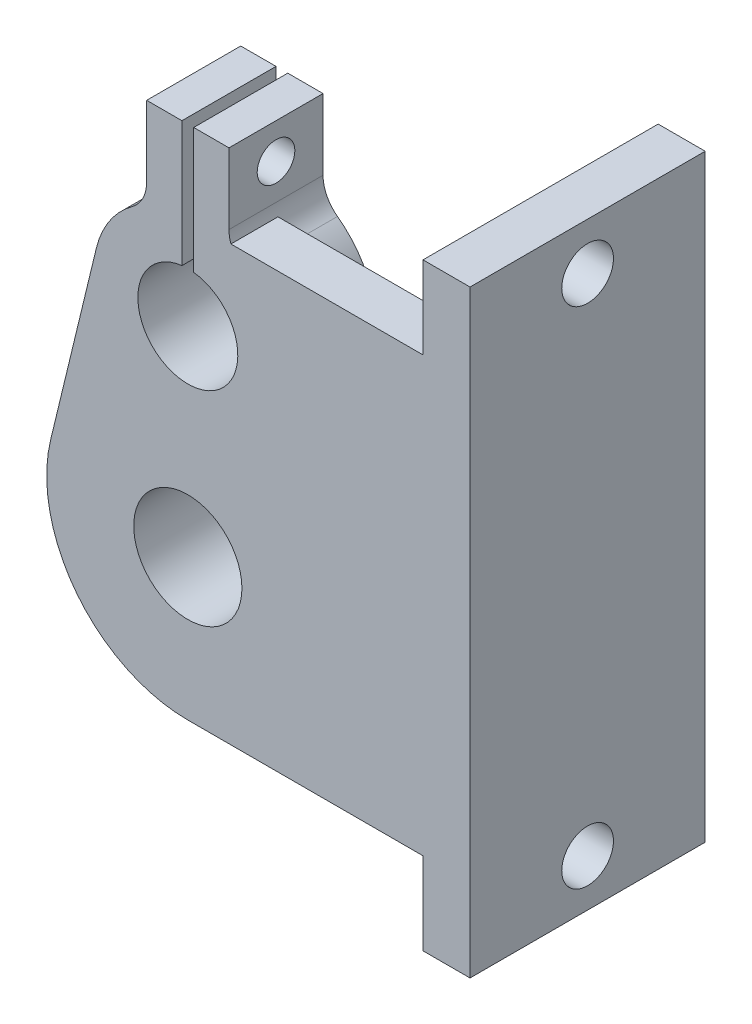
ISO-10303-21;
HEADER;
FILE_DESCRIPTION(('STEP AP214'),'2;1');
FILE_NAME('part.step','',(''),(''),'','','');
FILE_SCHEMA(('AUTOMOTIVE_DESIGN { 1 0 10303 214 1 1 1 1 }'));
ENDSEC;
DATA;
#1=APPLICATION_CONTEXT('core data for automotive mechanical design processes');
#2=APPLICATION_PROTOCOL_DEFINITION('international standard','automotive_design',2000,#1);
#3=PRODUCT_CONTEXT('',#1,'mechanical');
#4=PRODUCT('Part','Part','',(#3));
#5=PRODUCT_RELATED_PRODUCT_CATEGORY('part','',(#4));
#6=PRODUCT_DEFINITION_FORMATION('','',#4);
#7=PRODUCT_DEFINITION_CONTEXT('part definition',#1,'design');
#8=PRODUCT_DEFINITION('design','',#6,#7);
#9=PRODUCT_DEFINITION_SHAPE('','',#8);
#10=(LENGTH_UNIT() NAMED_UNIT(*) SI_UNIT(.MILLI.,.METRE.));
#11=(NAMED_UNIT(*) PLANE_ANGLE_UNIT() SI_UNIT($,.RADIAN.));
#12=(NAMED_UNIT(*) SI_UNIT($,.STERADIAN.) SOLID_ANGLE_UNIT());
#13=UNCERTAINTY_MEASURE_WITH_UNIT(LENGTH_MEASURE(1.E-05),#10,'distance_accuracy_value','');
#14=(GEOMETRIC_REPRESENTATION_CONTEXT(3) GLOBAL_UNCERTAINTY_ASSIGNED_CONTEXT((#13)) GLOBAL_UNIT_ASSIGNED_CONTEXT((#10,
#11,#12)) REPRESENTATION_CONTEXT('',''));
#15=CARTESIAN_POINT('',(0.,0.,0.));
#16=DIRECTION('',(0.,0.,1.));
#17=DIRECTION('',(1.,0.,0.));
#18=AXIS2_PLACEMENT_3D('',#15,#16,#17);
#19=CARTESIAN_POINT('',(48.,0.,4.));
#20=DIRECTION('',(1.,0.,0.));
#21=DIRECTION('',(0.,0.,-1.));
#22=AXIS2_PLACEMENT_3D('',#19,#20,#21);
#23=PLANE('',#22);
#24=DIRECTION('',(0.,-1.,0.));
#25=VECTOR('',#24,1.);
#26=CARTESIAN_POINT('',(48.,0.,4.));
#27=LINE('',#26,#25);
#28=CARTESIAN_POINT('',(48.,52.893747284969,4.));
#29=VERTEX_POINT('',#28);
#30=CARTESIAN_POINT('',(48.,2.,4.));
#31=VERTEX_POINT('',#30);
#32=EDGE_CURVE('E381',#29,#31,#27,.T.);
#33=ORIENTED_EDGE('',*,*,#32,.T.);
#34=DIRECTION('',(0.,0.,-1.));
#35=VECTOR('',#34,1.);
#36=CARTESIAN_POINT('',(48.,2.,4.));
#37=LINE('',#36,#35);
#38=CARTESIAN_POINT('',(48.,2.,-16.));
#39=VERTEX_POINT('',#38);
#40=EDGE_CURVE('E447',#31,#39,#37,.T.);
#41=ORIENTED_EDGE('',*,*,#40,.T.);
#42=DIRECTION('',(0.,-1.,0.));
#43=VECTOR('',#42,1.);
#44=CARTESIAN_POINT('',(48.,0.,-16.));
#45=LINE('',#44,#43);
#46=CARTESIAN_POINT('',(48.,52.893747284969,-16.));
#47=VERTEX_POINT('',#46);
#48=EDGE_CURVE('E304',#47,#39,#45,.T.);
#49=ORIENTED_EDGE('',*,*,#48,.F.);
#50=DIRECTION('',(0.,0.,-1.));
#51=VECTOR('',#50,1.);
#52=CARTESIAN_POINT('',(48.,52.893747284969,4.));
#53=LINE('',#52,#51);
#54=EDGE_CURVE('E445',#29,#47,#53,.T.);
#55=ORIENTED_EDGE('',*,*,#54,.F.);
#56=EDGE_LOOP('',(#33,#41,#49,#55));
#57=FACE_BOUND('',#56,.T.);
#58=CARTESIAN_POINT('',(48.,48.893747284969,-5.99999999999999));
#59=DIRECTION('',(-1.,0.,0.));
#60=DIRECTION('',(0.,0.,1.));
#61=AXIS2_PLACEMENT_3D('',#58,#59,#60);
#62=CIRCLE('',#61,2.20000000000006);
#63=CARTESIAN_POINT('',(48.,48.893747284969,-3.79999999999993));
#64=VERTEX_POINT('',#63);
#65=EDGE_CURVE('E284',#64,#64,#62,.T.);
#66=ORIENTED_EDGE('',*,*,#65,.T.);
#67=EDGE_LOOP('',(#66));
#68=FACE_BOUND('',#67,.T.);
#69=CARTESIAN_POINT('',(48.,6.,-6.));
#70=DIRECTION('',(-1.,0.,0.));
#71=DIRECTION('',(0.,0.,1.));
#72=AXIS2_PLACEMENT_3D('',#69,#70,#71);
#73=CIRCLE('',#72,2.19999999999994);
#74=CARTESIAN_POINT('',(48.,6.,-3.80000000000006));
#75=VERTEX_POINT('',#74);
#76=EDGE_CURVE('E290',#75,#75,#73,.F.);
#77=ORIENTED_EDGE('',*,*,#76,.F.);
#78=EDGE_LOOP('',(#77));
#79=FACE_BOUND('',#78,.T.);
#80=ADVANCED_FACE('F38',(#57,#68,#79),#23,.T.);
#81=CARTESIAN_POINT('',(44.0000000000017,0.,4.));
#82=DIRECTION('',(-1.,0.,0.));
#83=DIRECTION('',(0.,0.,1.));
#84=AXIS2_PLACEMENT_3D('',#81,#82,#83);
#85=PLANE('',#84);
#86=DIRECTION('',(0.,0.,-1.));
#87=VECTOR('',#86,1.);
#88=CARTESIAN_POINT('',(44.0000000000017,38.393747284969,4.));
#89=LINE('',#88,#87);
#90=CARTESIAN_POINT('',(44.0000000000017,38.393747284969,0.));
#91=VERTEX_POINT('',#90);
#92=CARTESIAN_POINT('',(44.0000000000017,38.393747284969,-13.9999999999997));
#93=VERTEX_POINT('',#92);
#94=EDGE_CURVE('E235',#91,#93,#89,.T.);
#95=ORIENTED_EDGE('',*,*,#94,.F.);
#96=DIRECTION('',(0.,1.,0.));
#97=VECTOR('',#96,1.);
#98=CARTESIAN_POINT('',(44.0000000000017,0.,0.));
#99=LINE('',#98,#97);
#100=CARTESIAN_POINT('',(44.0000000000017,45.893747284969,0.));
#101=VERTEX_POINT('',#100);
#102=EDGE_CURVE('E42',#91,#101,#99,.T.);
#103=ORIENTED_EDGE('',*,*,#102,.T.);
#104=DIRECTION('',(0.,0.,-1.));
#105=VECTOR('',#104,1.);
#106=CARTESIAN_POINT('',(44.0000000000017,45.893747284969,4.));
#107=LINE('',#106,#105);
#108=CARTESIAN_POINT('',(44.0000000000017,45.893747284969,4.));
#109=VERTEX_POINT('',#108);
#110=EDGE_CURVE('E442',#109,#101,#107,.T.);
#111=ORIENTED_EDGE('',*,*,#110,.F.);
#112=DIRECTION('',(0.,1.,0.));
#113=VECTOR('',#112,1.);
#114=CARTESIAN_POINT('',(44.0000000000017,0.,4.));
#115=LINE('',#114,#113);
#116=CARTESIAN_POINT('',(44.0000000000017,52.893747284969,4.));
#117=VERTEX_POINT('',#116);
#118=EDGE_CURVE('E378',#109,#117,#115,.T.);
#119=ORIENTED_EDGE('',*,*,#118,.T.);
#120=DIRECTION('',(0.,0.,-1.));
#121=VECTOR('',#120,1.);
#122=CARTESIAN_POINT('',(44.0000000000017,52.893747284969,4.));
#123=LINE('',#122,#121);
#124=CARTESIAN_POINT('',(44.0000000000017,52.893747284969,-16.));
#125=VERTEX_POINT('',#124);
#126=EDGE_CURVE('E443',#117,#125,#123,.T.);
#127=ORIENTED_EDGE('',*,*,#126,.T.);
#128=DIRECTION('',(0.,1.,0.));
#129=VECTOR('',#128,1.);
#130=CARTESIAN_POINT('',(44.0000000000017,0.,-16.));
#131=LINE('',#130,#129);
#132=CARTESIAN_POINT('',(44.0000000000017,2.,-16.));
#133=VERTEX_POINT('',#132);
#134=EDGE_CURVE('E298',#133,#125,#131,.T.);
#135=ORIENTED_EDGE('',*,*,#134,.F.);
#136=DIRECTION('',(0.,0.,-1.));
#137=VECTOR('',#136,1.);
#138=CARTESIAN_POINT('',(44.,2.,4.));
#139=LINE('',#138,#137);
#140=CARTESIAN_POINT('',(44.,2.,4.));
#141=VERTEX_POINT('',#140);
#142=EDGE_CURVE('E450',#141,#133,#139,.T.);
#143=ORIENTED_EDGE('',*,*,#142,.F.);
#144=CARTESIAN_POINT('',(44.0000000000009,9.00000000000001,4.));
#145=VERTEX_POINT('',#144);
#146=EDGE_CURVE('E374',#141,#145,#115,.T.);
#147=ORIENTED_EDGE('',*,*,#146,.T.);
#148=DIRECTION('',(0.,0.,-1.));
#149=VECTOR('',#148,1.);
#150=CARTESIAN_POINT('',(44.0000000000009,9.00000000000001,4.));
#151=LINE('',#150,#149);
#152=CARTESIAN_POINT('',(44.0000000000009,9.00000000000001,0.));
#153=VERTEX_POINT('',#152);
#154=EDGE_CURVE('E452',#145,#153,#151,.T.);
#155=ORIENTED_EDGE('',*,*,#154,.T.);
#156=CARTESIAN_POINT('',(44.0000000000017,16.5,0.));
#157=VERTEX_POINT('',#156);
#158=EDGE_CURVE('E11',#153,#157,#99,.T.);
#159=ORIENTED_EDGE('',*,*,#158,.T.);
#160=DIRECTION('',(0.,0.,1.));
#161=VECTOR('',#160,1.);
#162=CARTESIAN_POINT('',(44.0000000000017,16.5,4.));
#163=LINE('',#162,#161);
#164=CARTESIAN_POINT('',(44.0000000000017,16.5,-13.9999999999997));
#165=VERTEX_POINT('',#164);
#166=EDGE_CURVE('E266',#165,#157,#163,.T.);
#167=ORIENTED_EDGE('',*,*,#166,.F.);
#168=DIRECTION('',(0.,1.,0.));
#169=VECTOR('',#168,1.);
#170=CARTESIAN_POINT('',(44.0000000000017,0.,-13.9999999999997));
#171=LINE('',#170,#169);
#172=CARTESIAN_POINT('',(44.0000000000017,21.5,-13.9999999999997));
#173=VERTEX_POINT('',#172);
#174=EDGE_CURVE('E270',#173,#165,#171,.F.);
#175=ORIENTED_EDGE('',*,*,#174,.F.);
#176=DIRECTION('',(0.,0.,1.));
#177=VECTOR('',#176,1.);
#178=CARTESIAN_POINT('',(44.0000000000017,21.5,4.));
#179=LINE('',#178,#177);
#180=CARTESIAN_POINT('',(44.0000000000017,21.5,0.));
#181=VERTEX_POINT('',#180);
#182=EDGE_CURVE('E260',#173,#181,#179,.T.);
#183=ORIENTED_EDGE('',*,*,#182,.T.);
#184=CARTESIAN_POINT('',(44.0000000000017,33.393747284969,0.));
#185=VERTEX_POINT('',#184);
#186=EDGE_CURVE('E48',#181,#185,#99,.T.);
#187=ORIENTED_EDGE('',*,*,#186,.T.);
#188=DIRECTION('',(0.,0.,-1.));
#189=VECTOR('',#188,1.);
#190=CARTESIAN_POINT('',(44.0000000000017,33.393747284969,4.));
#191=LINE('',#190,#189);
#192=CARTESIAN_POINT('',(44.0000000000017,33.393747284969,-13.9999999999997));
#193=VERTEX_POINT('',#192);
#194=EDGE_CURVE('E61',#185,#193,#191,.T.);
#195=ORIENTED_EDGE('',*,*,#194,.T.);
#196=DIRECTION('',(0.,-1.,0.));
#197=VECTOR('',#196,1.);
#198=CARTESIAN_POINT('',(44.0000000000017,0.,-13.9999999999997));
#199=LINE('',#198,#197);
#200=EDGE_CURVE('E56',#93,#193,#199,.T.);
#201=ORIENTED_EDGE('',*,*,#200,.F.);
#202=EDGE_LOOP('',(#95,#103,#111,#119,#127,#135,#143,#147,#155,#159,#167,#175,#183,#187,#195,#201));
#203=FACE_BOUND('',#202,.T.);
#204=CARTESIAN_POINT('',(44.0000000000017,48.893747284969,-5.99999999999999));
#205=DIRECTION('',(-1.,0.,0.));
#206=DIRECTION('',(0.,0.,1.));
#207=AXIS2_PLACEMENT_3D('',#204,#205,#206);
#208=CIRCLE('',#207,2.20000000000006);
#209=CARTESIAN_POINT('',(44.0000000000017,48.893747284969,-3.79999999999993));
#210=VERTEX_POINT('',#209);
#211=EDGE_CURVE('E283',#210,#210,#208,.T.);
#212=ORIENTED_EDGE('',*,*,#211,.F.);
#213=EDGE_LOOP('',(#212));
#214=FACE_BOUND('',#213,.T.);
#215=CARTESIAN_POINT('',(44.0000000000017,6.,-6.));
#216=DIRECTION('',(-1.,0.,0.));
#217=DIRECTION('',(0.,0.,1.));
#218=AXIS2_PLACEMENT_3D('',#215,#216,#217);
#219=CIRCLE('',#218,2.19999999999994);
#220=CARTESIAN_POINT('',(44.0000000000017,6.,-3.80000000000006));
#221=VERTEX_POINT('',#220);
#222=EDGE_CURVE('E287',#221,#221,#219,.F.);
#223=ORIENTED_EDGE('',*,*,#222,.T.);
#224=EDGE_LOOP('',(#223));
#225=FACE_BOUND('',#224,.T.);
#226=ADVANCED_FACE('F566',(#203,#214,#225),#85,.T.);
#227=CARTESIAN_POINT('',(0.,0.,0.));
#228=DIRECTION('',(0.,0.,1.));
#229=DIRECTION('',(1.,0.,0.));
#230=AXIS2_PLACEMENT_3D('',#227,#228,#229);
#231=PLANE('',#230);
#232=ORIENTED_EDGE('',*,*,#102,.F.);
#233=DIRECTION('',(-1.,0.,0.));
#234=VECTOR('',#233,1.);
#235=CARTESIAN_POINT('',(0.,38.393747284969,0.));
#236=LINE('',#235,#234);
#237=CARTESIAN_POINT('',(38.,38.393747284969,0.));
#238=VERTEX_POINT('',#237);
#239=EDGE_CURVE('E230',#91,#238,#236,.T.);
#240=ORIENTED_EDGE('',*,*,#239,.T.);
#241=DIRECTION('',(0.,-1.,0.));
#242=VECTOR('',#241,1.);
#243=CARTESIAN_POINT('',(38.,0.,0.));
#244=LINE('',#243,#242);
#245=CARTESIAN_POINT('',(38.,33.393747284969,0.));
#246=VERTEX_POINT('',#245);
#247=EDGE_CURVE('E224',#238,#246,#244,.T.);
#248=ORIENTED_EDGE('',*,*,#247,.T.);
#249=DIRECTION('',(-1.,0.,0.));
#250=VECTOR('',#249,1.);
#251=CARTESIAN_POINT('',(0.,33.393747284969,0.));
#252=LINE('',#251,#250);
#253=EDGE_CURVE('E228',#185,#246,#252,.T.);
#254=ORIENTED_EDGE('',*,*,#253,.F.);
#255=ORIENTED_EDGE('',*,*,#186,.F.);
#256=DIRECTION('',(1.,0.,0.));
#257=VECTOR('',#256,1.);
#258=CARTESIAN_POINT('',(0.,21.5,0.));
#259=LINE('',#258,#257);
#260=CARTESIAN_POINT('',(38.,21.5,0.));
#261=VERTEX_POINT('',#260);
#262=EDGE_CURVE('E255',#261,#181,#259,.T.);
#263=ORIENTED_EDGE('',*,*,#262,.F.);
#264=DIRECTION('',(0.,1.,0.));
#265=VECTOR('',#264,1.);
#266=CARTESIAN_POINT('',(38.,0.,0.));
#267=LINE('',#266,#265);
#268=CARTESIAN_POINT('',(38.,16.5,0.));
#269=VERTEX_POINT('',#268);
#270=EDGE_CURVE('E268',#261,#269,#267,.F.);
#271=ORIENTED_EDGE('',*,*,#270,.T.);
#272=DIRECTION('',(1.,0.,0.));
#273=VECTOR('',#272,1.);
#274=CARTESIAN_POINT('',(0.,16.5,0.));
#275=LINE('',#274,#273);
#276=EDGE_CURVE('E263',#269,#157,#275,.T.);
#277=ORIENTED_EDGE('',*,*,#276,.T.);
#278=ORIENTED_EDGE('',*,*,#158,.F.);
#279=DIRECTION('',(1.,0.,0.));
#280=VECTOR('',#279,1.);
#281=CARTESIAN_POINT('',(0.,9.00000000000001,0.));
#282=LINE('',#281,#280);
#283=CARTESIAN_POINT('',(24.,9.00000000000001,0.));
#284=VERTEX_POINT('',#283);
#285=EDGE_CURVE('E364',#284,#153,#282,.T.);
#286=ORIENTED_EDGE('',*,*,#285,.F.);
#287=CARTESIAN_POINT('',(24.,21.,0.));
#288=DIRECTION('',(0.,0.,1.));
#289=DIRECTION('',(1.,0.,0.));
#290=AXIS2_PLACEMENT_3D('',#287,#288,#289);
#291=CIRCLE('',#290,12.);
#292=CARTESIAN_POINT('',(35.6630905707235,23.8235294117647,0.));
#293=VERTEX_POINT('',#292);
#294=EDGE_CURVE('E353',#284,#293,#291,.T.);
#295=ORIENTED_EDGE('',*,*,#294,.T.);
#296=DIRECTION('',(0.235294117647059,-0.971924214226959,0.));
#297=VECTOR('',#296,1.);
#298=CARTESIAN_POINT('',(39.1368199060733,9.47467237930241,0.));
#299=LINE('',#298,#297);
#300=CARTESIAN_POINT('',(31.7753937138157,39.8823529411765,0.));
#301=VERTEX_POINT('',#300);
#302=EDGE_CURVE('E356',#301,#293,#299,.T.);
#303=ORIENTED_EDGE('',*,*,#302,.F.);
#304=CARTESIAN_POINT('',(24.,38.,0.));
#305=DIRECTION('',(0.,0.,1.));
#306=DIRECTION('',(1.,0.,0.));
#307=AXIS2_PLACEMENT_3D('',#304,#305,#306);
#308=CIRCLE('',#307,7.99999999999998);
#309=CARTESIAN_POINT('',(28.7272727272727,44.4539052179268,0.));
#310=VERTEX_POINT('',#309);
#311=EDGE_CURVE('E310',#301,#310,#308,.T.);
#312=ORIENTED_EDGE('',*,*,#311,.T.);
#313=CARTESIAN_POINT('',(30.5,46.8741196746494,0.));
#314=DIRECTION('',(0.,0.,1.));
#315=DIRECTION('',(1.,0.,0.));
#316=AXIS2_PLACEMENT_3D('',#313,#314,#315);
#317=CIRCLE('',#316,3.);
#318=CARTESIAN_POINT('',(27.6647098953454,45.893747284969,0.));
#319=VERTEX_POINT('',#318);
#320=EDGE_CURVE('E306',#319,#310,#317,.T.);
#321=ORIENTED_EDGE('',*,*,#320,.F.);
#322=DIRECTION('',(-1.,0.,0.));
#323=VECTOR('',#322,1.);
#324=CARTESIAN_POINT('',(0.,45.893747284969,0.));
#325=LINE('',#324,#323);
#326=EDGE_CURVE('E372',#101,#319,#325,.T.);
#327=ORIENTED_EDGE('',*,*,#326,.F.);
#328=EDGE_LOOP('',(#232,#240,#248,#254,#255,#263,#271,#277,#278,#286,#295,#303,#312,#321,#327));
#329=FACE_BOUND('',#328,.T.);
#330=ADVANCED_FACE('F227',(#329),#231,.F.);
#331=CARTESIAN_POINT('',(24.,21.,4.));
#332=DIRECTION('',(0.,0.,-1.));
#333=DIRECTION('',(-1.,0.,0.));
#334=AXIS2_PLACEMENT_3D('',#331,#332,#333);
#335=CYLINDRICAL_SURFACE('',#334,12.);
#336=DIRECTION('',(0.,0.,-1.));
#337=VECTOR('',#336,1.);
#338=CARTESIAN_POINT('',(12.3369094292765,23.8235294117647,4.));
#339=LINE('',#338,#337);
#340=CARTESIAN_POINT('',(12.3369094292765,23.8235294117647,4.));
#341=VERTEX_POINT('',#340);
#342=CARTESIAN_POINT('',(12.3369094292765,23.8235294117647,-4.));
#343=VERTEX_POINT('',#342);
#344=EDGE_CURVE('E417',#341,#343,#339,.T.);
#345=ORIENTED_EDGE('',*,*,#344,.T.);
#346=CARTESIAN_POINT('',(24.,21.,-4.));
#347=DIRECTION('',(0.,0.,1.));
#348=DIRECTION('',(1.,0.,0.));
#349=AXIS2_PLACEMENT_3D('',#346,#347,#348);
#350=CIRCLE('',#349,12.);
#351=CARTESIAN_POINT('',(35.6630905707235,23.8235294117647,-4.));
#352=VERTEX_POINT('',#351);
#353=EDGE_CURVE('E340',#343,#352,#350,.T.);
#354=ORIENTED_EDGE('',*,*,#353,.T.);
#355=DIRECTION('',(0.,0.,1.));
#356=VECTOR('',#355,1.);
#357=CARTESIAN_POINT('',(35.6630905707235,23.8235294117647,-4.));
#358=LINE('',#357,#356);
#359=EDGE_CURVE('E351',#352,#293,#358,.T.);
#360=ORIENTED_EDGE('',*,*,#359,.T.);
#361=ORIENTED_EDGE('',*,*,#294,.F.);
#362=DIRECTION('',(0.,0.,-1.));
#363=VECTOR('',#362,1.);
#364=CARTESIAN_POINT('',(24.,9.,4.));
#365=LINE('',#364,#363);
#366=CARTESIAN_POINT('',(24.,9.,4.));
#367=VERTEX_POINT('',#366);
#368=EDGE_CURVE('E453',#367,#284,#365,.T.);
#369=ORIENTED_EDGE('',*,*,#368,.F.);
#370=CARTESIAN_POINT('',(24.,21.,4.));
#371=DIRECTION('',(0.,0.,1.));
#372=DIRECTION('',(1.,0.,0.));
#373=AXIS2_PLACEMENT_3D('',#370,#371,#372);
#374=CIRCLE('',#373,12.);
#375=EDGE_CURVE('E368',#341,#367,#374,.T.);
#376=ORIENTED_EDGE('',*,*,#375,.F.);
#377=EDGE_LOOP('',(#345,#354,#360,#361,#369,#376));
#378=FACE_BOUND('',#377,.T.);
#379=ADVANCED_FACE('F40',(#378),#335,.T.);
#380=CARTESIAN_POINT('',(0.,9.00000000000001,4.));
#381=DIRECTION('',(0.,1.,0.));
#382=DIRECTION('',(0.,0.,1.));
#383=AXIS2_PLACEMENT_3D('',#380,#381,#382);
#384=PLANE('',#383);
#385=ORIENTED_EDGE('',*,*,#285,.T.);
#386=ORIENTED_EDGE('',*,*,#154,.F.);
#387=DIRECTION('',(1.,0.,0.));
#388=VECTOR('',#387,1.);
#389=CARTESIAN_POINT('',(0.,9.00000000000001,4.));
#390=LINE('',#389,#388);
#391=EDGE_CURVE('E371',#367,#145,#390,.T.);
#392=ORIENTED_EDGE('',*,*,#391,.F.);
#393=ORIENTED_EDGE('',*,*,#368,.T.);
#394=EDGE_LOOP('',(#385,#386,#392,#393));
#395=FACE_BOUND('',#394,.T.);
#396=ADVANCED_FACE('F549',(#395),#384,.F.);
#397=CARTESIAN_POINT('',(0.,2.00000000000001,4.));
#398=DIRECTION('',(0.,-1.,0.));
#399=DIRECTION('',(1.,0.,0.));
#400=AXIS2_PLACEMENT_3D('',#397,#398,#399);
#401=PLANE('',#400);
#402=ORIENTED_EDGE('',*,*,#142,.T.);
#403=DIRECTION('',(-1.,0.,0.));
#404=VECTOR('',#403,1.);
#405=CARTESIAN_POINT('',(0.,2.00000000000001,-16.));
#406=LINE('',#405,#404);
#407=EDGE_CURVE('E301',#39,#133,#406,.T.);
#408=ORIENTED_EDGE('',*,*,#407,.F.);
#409=ORIENTED_EDGE('',*,*,#40,.F.);
#410=DIRECTION('',(-1.,0.,0.));
#411=VECTOR('',#410,1.);
#412=CARTESIAN_POINT('',(0.,2.00000000000001,4.));
#413=LINE('',#412,#411);
#414=EDGE_CURVE('E377',#31,#141,#413,.T.);
#415=ORIENTED_EDGE('',*,*,#414,.T.);
#416=EDGE_LOOP('',(#402,#408,#409,#415));
#417=FACE_BOUND('',#416,.T.);
#418=ADVANCED_FACE('F555',(#417),#401,.T.);
#419=CARTESIAN_POINT('',(0.,52.893747284969,4.));
#420=DIRECTION('',(0.,-1.,0.));
#421=DIRECTION('',(0.,0.,-1.));
#422=AXIS2_PLACEMENT_3D('',#419,#420,#421);
#423=PLANE('',#422);
#424=ORIENTED_EDGE('',*,*,#54,.T.);
#425=DIRECTION('',(-1.,0.,0.));
#426=VECTOR('',#425,1.);
#427=CARTESIAN_POINT('',(0.,52.893747284969,-16.));
#428=LINE('',#427,#426);
#429=EDGE_CURVE('E293',#47,#125,#428,.T.);
#430=ORIENTED_EDGE('',*,*,#429,.T.);
#431=ORIENTED_EDGE('',*,*,#126,.F.);
#432=DIRECTION('',(-1.,0.,0.));
#433=VECTOR('',#432,1.);
#434=CARTESIAN_POINT('',(0.,52.893747284969,4.));
#435=LINE('',#434,#433);
#436=EDGE_CURVE('E383',#29,#117,#435,.T.);
#437=ORIENTED_EDGE('',*,*,#436,.F.);
#438=EDGE_LOOP('',(#424,#430,#431,#437));
#439=FACE_BOUND('',#438,.T.);
#440=ADVANCED_FACE('F564',(#439),#423,.F.);
#441=CARTESIAN_POINT('',(0.,45.893747284969,4.));
#442=DIRECTION('',(0.,-1.,0.));
#443=DIRECTION('',(0.,0.,-1.));
#444=AXIS2_PLACEMENT_3D('',#441,#442,#443);
#445=PLANE('',#444);
#446=ORIENTED_EDGE('',*,*,#326,.T.);
#447=DIRECTION('',(0.,0.,-1.));
#448=VECTOR('',#447,1.);
#449=CARTESIAN_POINT('',(27.6647098953454,45.893747284969,4.));
#450=LINE('',#449,#448);
#451=CARTESIAN_POINT('',(27.6647098953454,45.893747284969,4.));
#452=VERTEX_POINT('',#451);
#453=EDGE_CURVE('E439',#452,#319,#450,.T.);
#454=ORIENTED_EDGE('',*,*,#453,.F.);
#455=DIRECTION('',(-1.,0.,0.));
#456=VECTOR('',#455,1.);
#457=CARTESIAN_POINT('',(0.,45.893747284969,4.));
#458=LINE('',#457,#456);
#459=EDGE_CURVE('E385',#109,#452,#458,.T.);
#460=ORIENTED_EDGE('',*,*,#459,.F.);
#461=ORIENTED_EDGE('',*,*,#110,.T.);
#462=EDGE_LOOP('',(#446,#454,#460,#461));
#463=FACE_BOUND('',#462,.T.);
#464=ADVANCED_FACE('F479',(#463),#445,.F.);
#465=CARTESIAN_POINT('',(30.5,46.8741196746494,4.));
#466=DIRECTION('',(0.,0.,-1.));
#467=DIRECTION('',(-1.,0.,0.));
#468=AXIS2_PLACEMENT_3D('',#465,#466,#467);
#469=CYLINDRICAL_SURFACE('',#468,3.);
#470=ORIENTED_EDGE('',*,*,#453,.T.);
#471=ORIENTED_EDGE('',*,*,#320,.T.);
#472=DIRECTION('',(0.,0.,1.));
#473=VECTOR('',#472,1.);
#474=CARTESIAN_POINT('',(28.7272727272727,44.4539052179268,-4.));
#475=LINE('',#474,#473);
#476=CARTESIAN_POINT('',(28.7272727272727,44.4539052179268,-4.));
#477=VERTEX_POINT('',#476);
#478=EDGE_CURVE('E361',#477,#310,#475,.T.);
#479=ORIENTED_EDGE('',*,*,#478,.F.);
#480=CARTESIAN_POINT('',(30.5,46.8741196746494,-4.));
#481=DIRECTION('',(0.,0.,1.));
#482=DIRECTION('',(1.,0.,0.));
#483=AXIS2_PLACEMENT_3D('',#480,#481,#482);
#484=CIRCLE('',#483,3.);
#485=CARTESIAN_POINT('',(27.5,46.8741196746494,-4.));
#486=VERTEX_POINT('',#485);
#487=EDGE_CURVE('E307',#486,#477,#484,.T.);
#488=ORIENTED_EDGE('',*,*,#487,.F.);
#489=DIRECTION('',(0.,0.,-1.));
#490=VECTOR('',#489,1.);
#491=CARTESIAN_POINT('',(27.5,46.8741196746494,4.));
#492=LINE('',#491,#490);
#493=CARTESIAN_POINT('',(27.5,46.8741196746494,4.));
#494=VERTEX_POINT('',#493);
#495=EDGE_CURVE('E437',#494,#486,#492,.T.);
#496=ORIENTED_EDGE('',*,*,#495,.F.);
#497=CARTESIAN_POINT('',(30.5,46.8741196746494,4.));
#498=DIRECTION('',(0.,0.,1.));
#499=DIRECTION('',(1.,0.,0.));
#500=AXIS2_PLACEMENT_3D('',#497,#498,#499);
#501=CIRCLE('',#500,3.);
#502=EDGE_CURVE('E387',#494,#452,#501,.T.);
#503=ORIENTED_EDGE('',*,*,#502,.T.);
#504=EDGE_LOOP('',(#470,#471,#479,#488,#496,#503));
#505=FACE_BOUND('',#504,.T.);
#506=ADVANCED_FACE('F487',(#505),#469,.F.);
#507=CARTESIAN_POINT('',(27.5,0.,4.));
#508=DIRECTION('',(1.,0.,0.));
#509=DIRECTION('',(0.,1.,0.));
#510=AXIS2_PLACEMENT_3D('',#507,#508,#509);
#511=PLANE('',#510);
#512=CARTESIAN_POINT('',(27.5,49.8937472849687,0.));
#513=DIRECTION('',(1.,0.,0.));
#514=DIRECTION('',(0.,1.,0.));
#515=AXIS2_PLACEMENT_3D('',#512,#513,#514);
#516=CIRCLE('',#515,1.6);
#517=CARTESIAN_POINT('',(27.5,51.4937472849687,0.));
#518=VERTEX_POINT('',#517);
#519=EDGE_CURVE('E280',#518,#518,#516,.T.);
#520=ORIENTED_EDGE('',*,*,#519,.F.);
#521=EDGE_LOOP('',(#520));
#522=FACE_BOUND('',#521,.T.);
#523=ORIENTED_EDGE('',*,*,#495,.T.);
#524=DIRECTION('',(0.,-1.,0.));
#525=VECTOR('',#524,1.);
#526=CARTESIAN_POINT('',(27.5,0.,-4.));
#527=LINE('',#526,#525);
#528=CARTESIAN_POINT('',(27.5,52.893747284969,-4.));
#529=VERTEX_POINT('',#528);
#530=EDGE_CURVE('E309',#529,#486,#527,.T.);
#531=ORIENTED_EDGE('',*,*,#530,.F.);
#532=DIRECTION('',(0.,0.,-1.));
#533=VECTOR('',#532,1.);
#534=CARTESIAN_POINT('',(27.5,52.893747284969,4.));
#535=LINE('',#534,#533);
#536=CARTESIAN_POINT('',(27.5,52.893747284969,4.));
#537=VERTEX_POINT('',#536);
#538=EDGE_CURVE('E435',#537,#529,#535,.T.);
#539=ORIENTED_EDGE('',*,*,#538,.F.);
#540=DIRECTION('',(0.,-1.,0.));
#541=VECTOR('',#540,1.);
#542=CARTESIAN_POINT('',(27.5,0.,4.));
#543=LINE('',#542,#541);
#544=EDGE_CURVE('E390',#537,#494,#543,.T.);
#545=ORIENTED_EDGE('',*,*,#544,.T.);
#546=EDGE_LOOP('',(#523,#531,#539,#545));
#547=FACE_BOUND('',#546,.T.);
#548=ADVANCED_FACE('F496',(#522,#547),#511,.T.);
#549=CARTESIAN_POINT('',(0.,52.893747284969,4.));
#550=DIRECTION('',(0.,-1.,0.));
#551=DIRECTION('',(0.,0.,-1.));
#552=AXIS2_PLACEMENT_3D('',#549,#550,#551);
#553=PLANE('',#552);
#554=ORIENTED_EDGE('',*,*,#538,.T.);
#555=DIRECTION('',(-1.,0.,0.));
#556=VECTOR('',#555,1.);
#557=CARTESIAN_POINT('',(0.,52.893747284969,-4.));
#558=LINE('',#557,#556);
#559=CARTESIAN_POINT('',(24.5,52.893747284969,-4.));
#560=VERTEX_POINT('',#559);
#561=EDGE_CURVE('E313',#529,#560,#558,.T.);
#562=ORIENTED_EDGE('',*,*,#561,.T.);
#563=DIRECTION('',(0.,0.,-1.));
#564=VECTOR('',#563,1.);
#565=CARTESIAN_POINT('',(24.5,52.893747284969,4.));
#566=LINE('',#565,#564);
#567=CARTESIAN_POINT('',(24.5,52.893747284969,4.));
#568=VERTEX_POINT('',#567);
#569=EDGE_CURVE('E433',#568,#560,#566,.T.);
#570=ORIENTED_EDGE('',*,*,#569,.F.);
#571=DIRECTION('',(-1.,0.,0.));
#572=VECTOR('',#571,1.);
#573=CARTESIAN_POINT('',(0.,52.893747284969,4.));
#574=LINE('',#573,#572);
#575=EDGE_CURVE('E393',#537,#568,#574,.T.);
#576=ORIENTED_EDGE('',*,*,#575,.F.);
#577=EDGE_LOOP('',(#554,#562,#570,#576));
#578=FACE_BOUND('',#577,.T.);
#579=ADVANCED_FACE('F502',(#578),#553,.F.);
#580=CARTESIAN_POINT('',(24.5,0.,4.));
#581=DIRECTION('',(1.,0.,0.));
#582=DIRECTION('',(0.,0.,-1.));
#583=AXIS2_PLACEMENT_3D('',#580,#581,#582);
#584=PLANE('',#583);
#585=CARTESIAN_POINT('',(24.5,49.8937472849687,0.));
#586=DIRECTION('',(1.,0.,0.));
#587=DIRECTION('',(0.,0.,-1.));
#588=AXIS2_PLACEMENT_3D('',#585,#586,#587);
#589=CIRCLE('',#588,1.6);
#590=CARTESIAN_POINT('',(24.5,49.8937472849687,-1.6));
#591=VERTEX_POINT('',#590);
#592=EDGE_CURVE('E277',#591,#591,#589,.T.);
#593=ORIENTED_EDGE('',*,*,#592,.T.);
#594=EDGE_LOOP('',(#593));
#595=FACE_BOUND('',#594,.T.);
#596=ORIENTED_EDGE('',*,*,#569,.T.);
#597=DIRECTION('',(0.,-1.,0.));
#598=VECTOR('',#597,1.);
#599=CARTESIAN_POINT('',(24.5,0.,-4.));
#600=LINE('',#599,#598);
#601=CARTESIAN_POINT('',(24.5,42.2204857540335,-4.));
#602=VERTEX_POINT('',#601);
#603=EDGE_CURVE('E316',#560,#602,#600,.T.);
#604=ORIENTED_EDGE('',*,*,#603,.T.);
#605=DIRECTION('',(0.,0.,-1.));
#606=VECTOR('',#605,1.);
#607=CARTESIAN_POINT('',(24.5,42.2204857540335,4.));
#608=LINE('',#607,#606);
#609=CARTESIAN_POINT('',(24.5,42.2204857540335,4.));
#610=VERTEX_POINT('',#609);
#611=EDGE_CURVE('E431',#610,#602,#608,.T.);
#612=ORIENTED_EDGE('',*,*,#611,.F.);
#613=DIRECTION('',(0.,-1.,0.));
#614=VECTOR('',#613,1.);
#615=CARTESIAN_POINT('',(24.5,0.,4.));
#616=LINE('',#615,#614);
#617=EDGE_CURVE('E395',#568,#610,#616,.T.);
#618=ORIENTED_EDGE('',*,*,#617,.F.);
#619=EDGE_LOOP('',(#596,#604,#612,#618));
#620=FACE_BOUND('',#619,.T.);
#621=ADVANCED_FACE('F508',(#595,#620),#584,.F.);
#622=CARTESIAN_POINT('',(24.,38.,4.));
#623=DIRECTION('',(0.,0.,-1.));
#624=DIRECTION('',(-1.,0.,0.));
#625=AXIS2_PLACEMENT_3D('',#622,#623,#624);
#626=CYLINDRICAL_SURFACE('',#625,4.25);
#627=ORIENTED_EDGE('',*,*,#611,.T.);
#628=CARTESIAN_POINT('',(24.,38.,-4.));
#629=DIRECTION('',(0.,0.,1.));
#630=DIRECTION('',(1.,0.,0.));
#631=AXIS2_PLACEMENT_3D('',#628,#629,#630);
#632=CIRCLE('',#631,4.25);
#633=CARTESIAN_POINT('',(23.5,42.2204857540335,-4.));
#634=VERTEX_POINT('',#633);
#635=EDGE_CURVE('E319',#634,#602,#632,.T.);
#636=ORIENTED_EDGE('',*,*,#635,.F.);
#637=DIRECTION('',(0.,0.,-1.));
#638=VECTOR('',#637,1.);
#639=CARTESIAN_POINT('',(23.5,42.2204857540335,4.));
#640=LINE('',#639,#638);
#641=CARTESIAN_POINT('',(23.5,42.2204857540335,4.));
#642=VERTEX_POINT('',#641);
#643=EDGE_CURVE('E429',#642,#634,#640,.T.);
#644=ORIENTED_EDGE('',*,*,#643,.F.);
#645=CARTESIAN_POINT('',(24.,38.,4.));
#646=DIRECTION('',(0.,0.,1.));
#647=DIRECTION('',(1.,0.,0.));
#648=AXIS2_PLACEMENT_3D('',#645,#646,#647);
#649=CIRCLE('',#648,4.25);
#650=EDGE_CURVE('E397',#642,#610,#649,.T.);
#651=ORIENTED_EDGE('',*,*,#650,.T.);
#652=EDGE_LOOP('',(#627,#636,#644,#651));
#653=FACE_BOUND('',#652,.T.);
#654=ADVANCED_FACE('F512',(#653),#626,.F.);
#655=CARTESIAN_POINT('',(23.5,0.,4.));
#656=DIRECTION('',(1.,0.,0.));
#657=DIRECTION('',(0.,0.,-1.));
#658=AXIS2_PLACEMENT_3D('',#655,#656,#657);
#659=PLANE('',#658);
#660=CARTESIAN_POINT('',(23.5,49.8937472849687,0.));
#661=DIRECTION('',(1.,0.,0.));
#662=DIRECTION('',(0.,0.,-1.));
#663=AXIS2_PLACEMENT_3D('',#660,#661,#662);
#664=CIRCLE('',#663,1.6);
#665=CARTESIAN_POINT('',(23.5,49.8937472849687,-1.6));
#666=VERTEX_POINT('',#665);
#667=EDGE_CURVE('E274',#666,#666,#664,.T.);
#668=ORIENTED_EDGE('',*,*,#667,.F.);
#669=EDGE_LOOP('',(#668));
#670=FACE_BOUND('',#669,.T.);
#671=ORIENTED_EDGE('',*,*,#643,.T.);
#672=DIRECTION('',(0.,-1.,0.));
#673=VECTOR('',#672,1.);
#674=CARTESIAN_POINT('',(23.5,0.,-4.));
#675=LINE('',#674,#673);
#676=CARTESIAN_POINT('',(23.5,52.893747284969,-4.));
#677=VERTEX_POINT('',#676);
#678=EDGE_CURVE('E322',#677,#634,#675,.T.);
#679=ORIENTED_EDGE('',*,*,#678,.F.);
#680=DIRECTION('',(0.,0.,-1.));
#681=VECTOR('',#680,1.);
#682=CARTESIAN_POINT('',(23.5,52.893747284969,4.));
#683=LINE('',#682,#681);
#684=CARTESIAN_POINT('',(23.5,52.893747284969,4.));
#685=VERTEX_POINT('',#684);
#686=EDGE_CURVE('E427',#685,#677,#683,.T.);
#687=ORIENTED_EDGE('',*,*,#686,.F.);
#688=DIRECTION('',(0.,-1.,0.));
#689=VECTOR('',#688,1.);
#690=CARTESIAN_POINT('',(23.5,0.,4.));
#691=LINE('',#690,#689);
#692=EDGE_CURVE('E400',#685,#642,#691,.T.);
#693=ORIENTED_EDGE('',*,*,#692,.T.);
#694=EDGE_LOOP('',(#671,#679,#687,#693));
#695=FACE_BOUND('',#694,.T.);
#696=ADVANCED_FACE('F515',(#670,#695),#659,.T.);
#697=CARTESIAN_POINT('',(0.,52.893747284969,4.));
#698=DIRECTION('',(0.,1.,0.));
#699=DIRECTION('',(0.,0.,1.));
#700=AXIS2_PLACEMENT_3D('',#697,#698,#699);
#701=PLANE('',#700);
#702=ORIENTED_EDGE('',*,*,#686,.T.);
#703=DIRECTION('',(1.,0.,0.));
#704=VECTOR('',#703,1.);
#705=CARTESIAN_POINT('',(0.,52.893747284969,-4.));
#706=LINE('',#705,#704);
#707=CARTESIAN_POINT('',(20.5,52.893747284969,-4.));
#708=VERTEX_POINT('',#707);
#709=EDGE_CURVE('E325',#708,#677,#706,.T.);
#710=ORIENTED_EDGE('',*,*,#709,.F.);
#711=DIRECTION('',(0.,0.,-1.));
#712=VECTOR('',#711,1.);
#713=CARTESIAN_POINT('',(20.5,52.893747284969,4.));
#714=LINE('',#713,#712);
#715=CARTESIAN_POINT('',(20.5,52.893747284969,4.));
#716=VERTEX_POINT('',#715);
#717=EDGE_CURVE('E425',#716,#708,#714,.T.);
#718=ORIENTED_EDGE('',*,*,#717,.F.);
#719=DIRECTION('',(1.,0.,0.));
#720=VECTOR('',#719,1.);
#721=CARTESIAN_POINT('',(0.,52.893747284969,4.));
#722=LINE('',#721,#720);
#723=EDGE_CURVE('E403',#716,#685,#722,.T.);
#724=ORIENTED_EDGE('',*,*,#723,.T.);
#725=EDGE_LOOP('',(#702,#710,#718,#724));
#726=FACE_BOUND('',#725,.T.);
#727=ADVANCED_FACE('F523',(#726),#701,.T.);
#728=CARTESIAN_POINT('',(20.5,0.,4.));
#729=DIRECTION('',(1.,0.,0.));
#730=DIRECTION('',(0.,1.,0.));
#731=AXIS2_PLACEMENT_3D('',#728,#729,#730);
#732=PLANE('',#731);
#733=CARTESIAN_POINT('',(20.5,49.8937472849687,0.));
#734=DIRECTION('',(1.,0.,0.));
#735=DIRECTION('',(0.,1.,0.));
#736=AXIS2_PLACEMENT_3D('',#733,#734,#735);
#737=CIRCLE('',#736,1.6);
#738=CARTESIAN_POINT('',(20.5,51.4937472849687,0.));
#739=VERTEX_POINT('',#738);
#740=EDGE_CURVE('E273',#739,#739,#737,.T.);
#741=ORIENTED_EDGE('',*,*,#740,.T.);
#742=EDGE_LOOP('',(#741));
#743=FACE_BOUND('',#742,.T.);
#744=ORIENTED_EDGE('',*,*,#717,.T.);
#745=DIRECTION('',(0.,-1.,0.));
#746=VECTOR('',#745,1.);
#747=CARTESIAN_POINT('',(20.5,0.,-4.));
#748=LINE('',#747,#746);
#749=CARTESIAN_POINT('',(20.5,46.8741196746494,-4.));
#750=VERTEX_POINT('',#749);
#751=EDGE_CURVE('E328',#708,#750,#748,.T.);
#752=ORIENTED_EDGE('',*,*,#751,.T.);
#753=DIRECTION('',(0.,0.,-1.));
#754=VECTOR('',#753,1.);
#755=CARTESIAN_POINT('',(20.5,46.8741196746494,4.));
#756=LINE('',#755,#754);
#757=CARTESIAN_POINT('',(20.5,46.8741196746494,4.));
#758=VERTEX_POINT('',#757);
#759=EDGE_CURVE('E423',#758,#750,#756,.T.);
#760=ORIENTED_EDGE('',*,*,#759,.F.);
#761=DIRECTION('',(0.,-1.,0.));
#762=VECTOR('',#761,1.);
#763=CARTESIAN_POINT('',(20.5,0.,4.));
#764=LINE('',#763,#762);
#765=EDGE_CURVE('E406',#716,#758,#764,.T.);
#766=ORIENTED_EDGE('',*,*,#765,.F.);
#767=EDGE_LOOP('',(#744,#752,#760,#766));
#768=FACE_BOUND('',#767,.T.);
#769=ADVANCED_FACE('F530',(#743,#768),#732,.F.);
#770=CARTESIAN_POINT('',(17.5,46.8741196746494,4.));
#771=DIRECTION('',(0.,0.,-1.));
#772=DIRECTION('',(-1.,0.,0.));
#773=AXIS2_PLACEMENT_3D('',#770,#771,#772);
#774=CYLINDRICAL_SURFACE('',#773,3.);
#775=ORIENTED_EDGE('',*,*,#759,.T.);
#776=CARTESIAN_POINT('',(17.5,46.8741196746494,-4.));
#777=DIRECTION('',(0.,0.,1.));
#778=DIRECTION('',(1.,0.,0.));
#779=AXIS2_PLACEMENT_3D('',#776,#777,#778);
#780=CIRCLE('',#779,3.);
#781=CARTESIAN_POINT('',(19.2727272727273,44.4539052179268,-4.));
#782=VERTEX_POINT('',#781);
#783=EDGE_CURVE('E331',#750,#782,#780,.F.);
#784=ORIENTED_EDGE('',*,*,#783,.T.);
#785=DIRECTION('',(0.,0.,-1.));
#786=VECTOR('',#785,1.);
#787=CARTESIAN_POINT('',(19.2727272727273,44.4539052179268,4.));
#788=LINE('',#787,#786);
#789=CARTESIAN_POINT('',(19.2727272727273,44.4539052179268,4.));
#790=VERTEX_POINT('',#789);
#791=EDGE_CURVE('E421',#790,#782,#788,.T.);
#792=ORIENTED_EDGE('',*,*,#791,.F.);
#793=CARTESIAN_POINT('',(17.5,46.8741196746494,4.));
#794=DIRECTION('',(0.,0.,1.));
#795=DIRECTION('',(1.,0.,0.));
#796=AXIS2_PLACEMENT_3D('',#793,#794,#795);
#797=CIRCLE('',#796,3.);
#798=EDGE_CURVE('E408',#758,#790,#797,.F.);
#799=ORIENTED_EDGE('',*,*,#798,.F.);
#800=EDGE_LOOP('',(#775,#784,#792,#799));
#801=FACE_BOUND('',#800,.T.);
#802=ADVANCED_FACE('F532',(#801),#774,.F.);
#803=CARTESIAN_POINT('',(24.,38.,4.));
#804=DIRECTION('',(0.,0.,-1.));
#805=DIRECTION('',(-1.,0.,0.));
#806=AXIS2_PLACEMENT_3D('',#803,#804,#805);
#807=CYLINDRICAL_SURFACE('',#806,7.99999999999999);
#808=ORIENTED_EDGE('',*,*,#791,.T.);
#809=CARTESIAN_POINT('',(24.,38.,-4.));
#810=DIRECTION('',(0.,0.,1.));
#811=DIRECTION('',(1.,0.,0.));
#812=AXIS2_PLACEMENT_3D('',#809,#810,#811);
#813=CIRCLE('',#812,7.99999999999999);
#814=CARTESIAN_POINT('',(16.2246062861844,39.8823529411765,-4.));
#815=VERTEX_POINT('',#814);
#816=EDGE_CURVE('E334',#782,#815,#813,.T.);
#817=ORIENTED_EDGE('',*,*,#816,.T.);
#818=DIRECTION('',(0.,0.,-1.));
#819=VECTOR('',#818,1.);
#820=CARTESIAN_POINT('',(16.2246062861844,39.8823529411765,4.));
#821=LINE('',#820,#819);
#822=CARTESIAN_POINT('',(16.2246062861844,39.8823529411765,4.));
#823=VERTEX_POINT('',#822);
#824=EDGE_CURVE('E419',#823,#815,#821,.T.);
#825=ORIENTED_EDGE('',*,*,#824,.F.);
#826=CARTESIAN_POINT('',(24.,38.,4.));
#827=DIRECTION('',(0.,0.,1.));
#828=DIRECTION('',(1.,0.,0.));
#829=AXIS2_PLACEMENT_3D('',#826,#827,#828);
#830=CIRCLE('',#829,7.99999999999999);
#831=EDGE_CURVE('E410',#790,#823,#830,.T.);
#832=ORIENTED_EDGE('',*,*,#831,.F.);
#833=EDGE_LOOP('',(#808,#817,#825,#832));
#834=FACE_BOUND('',#833,.T.);
#835=ADVANCED_FACE('F537',(#834),#807,.T.);
#836=CARTESIAN_POINT('',(6.20574064755981,-1.50235404020207,4.));
#837=DIRECTION('',(0.971924214226959,-0.235294117647061,0.));
#838=DIRECTION('',(0.235294117647061,0.971924214226959,0.));
#839=AXIS2_PLACEMENT_3D('',#836,#837,#838);
#840=PLANE('',#839);
#841=ORIENTED_EDGE('',*,*,#824,.T.);
#842=DIRECTION('',(-0.235294117647061,-0.971924214226959,0.));
#843=VECTOR('',#842,1.);
#844=CARTESIAN_POINT('',(6.20574064755981,-1.50235404020207,-4.));
#845=LINE('',#844,#843);
#846=EDGE_CURVE('E337',#815,#343,#845,.T.);
#847=ORIENTED_EDGE('',*,*,#846,.T.);
#848=ORIENTED_EDGE('',*,*,#344,.F.);
#849=DIRECTION('',(-0.235294117647061,-0.971924214226959,0.));
#850=VECTOR('',#849,1.);
#851=CARTESIAN_POINT('',(6.20574064755981,-1.50235404020207,4.));
#852=LINE('',#851,#850);
#853=EDGE_CURVE('E412',#823,#341,#852,.T.);
#854=ORIENTED_EDGE('',*,*,#853,.F.);
#855=EDGE_LOOP('',(#841,#847,#848,#854));
#856=FACE_BOUND('',#855,.T.);
#857=ADVANCED_FACE('F543',(#856),#840,.F.);
#858=CARTESIAN_POINT('',(24.,21.,4.));
#859=DIRECTION('',(0.,0.,-1.));
#860=DIRECTION('',(-1.,0.,0.));
#861=AXIS2_PLACEMENT_3D('',#858,#859,#860);
#862=CYLINDRICAL_SURFACE('',#861,4.6);
#863=CARTESIAN_POINT('',(24.,21.,4.));
#864=DIRECTION('',(0.,0.,1.));
#865=DIRECTION('',(1.,0.,0.));
#866=AXIS2_PLACEMENT_3D('',#863,#864,#865);
#867=CIRCLE('',#866,4.6);
#868=CARTESIAN_POINT('',(28.6,21.,4.));
#869=VERTEX_POINT('',#868);
#870=EDGE_CURVE('E414',#869,#869,#867,.T.);
#871=ORIENTED_EDGE('',*,*,#870,.T.);
#872=EDGE_LOOP('',(#871));
#873=FACE_BOUND('',#872,.T.);
#874=CARTESIAN_POINT('',(24.,21.,-4.));
#875=DIRECTION('',(0.,0.,1.));
#876=DIRECTION('',(1.,0.,0.));
#877=AXIS2_PLACEMENT_3D('',#874,#875,#876);
#878=CIRCLE('',#877,4.6);
#879=CARTESIAN_POINT('',(28.6,21.,-4.));
#880=VERTEX_POINT('',#879);
#881=EDGE_CURVE('E348',#880,#880,#878,.T.);
#882=ORIENTED_EDGE('',*,*,#881,.F.);
#883=EDGE_LOOP('',(#882));
#884=FACE_BOUND('',#883,.T.);
#885=ADVANCED_FACE('F609',(#873,#884),#862,.F.);
#886=CARTESIAN_POINT('',(0.,0.,4.));
#887=DIRECTION('',(0.,0.,1.));
#888=DIRECTION('',(1.,0.,0.));
#889=AXIS2_PLACEMENT_3D('',#886,#887,#888);
#890=PLANE('',#889);
#891=ORIENTED_EDGE('',*,*,#414,.F.);
#892=ORIENTED_EDGE('',*,*,#32,.F.);
#893=ORIENTED_EDGE('',*,*,#436,.T.);
#894=ORIENTED_EDGE('',*,*,#118,.F.);
#895=ORIENTED_EDGE('',*,*,#459,.T.);
#896=ORIENTED_EDGE('',*,*,#502,.F.);
#897=ORIENTED_EDGE('',*,*,#544,.F.);
#898=ORIENTED_EDGE('',*,*,#575,.T.);
#899=ORIENTED_EDGE('',*,*,#617,.T.);
#900=ORIENTED_EDGE('',*,*,#650,.F.);
#901=ORIENTED_EDGE('',*,*,#692,.F.);
#902=ORIENTED_EDGE('',*,*,#723,.F.);
#903=ORIENTED_EDGE('',*,*,#765,.T.);
#904=ORIENTED_EDGE('',*,*,#798,.T.);
#905=ORIENTED_EDGE('',*,*,#831,.T.);
#906=ORIENTED_EDGE('',*,*,#853,.T.);
#907=ORIENTED_EDGE('',*,*,#375,.T.);
#908=ORIENTED_EDGE('',*,*,#391,.T.);
#909=ORIENTED_EDGE('',*,*,#146,.F.);
#910=EDGE_LOOP('',(#891,#892,#893,#894,#895,#896,#897,#898,#899,#900,#901,#902,#903,#904,#905,
#906,#907,#908,#909));
#911=FACE_BOUND('',#910,.T.);
#912=ORIENTED_EDGE('',*,*,#870,.F.);
#913=EDGE_LOOP('',(#912));
#914=FACE_BOUND('',#913,.T.);
#915=ADVANCED_FACE('F493',(#911,#914),#890,.T.);
#916=CARTESIAN_POINT('',(24.,38.,-4.));
#917=DIRECTION('',(0.,0.,1.));
#918=DIRECTION('',(1.,0.,0.));
#919=AXIS2_PLACEMENT_3D('',#916,#917,#918);
#920=CYLINDRICAL_SURFACE('',#919,7.99999999999998);
#921=ORIENTED_EDGE('',*,*,#311,.F.);
#922=DIRECTION('',(0.,0.,1.));
#923=VECTOR('',#922,1.);
#924=CARTESIAN_POINT('',(31.7753937138157,39.8823529411765,-4.));
#925=LINE('',#924,#923);
#926=CARTESIAN_POINT('',(31.7753937138157,39.8823529411765,-4.));
#927=VERTEX_POINT('',#926);
#928=EDGE_CURVE('E365',#927,#301,#925,.T.);
#929=ORIENTED_EDGE('',*,*,#928,.F.);
#930=CARTESIAN_POINT('',(24.,38.,-4.));
#931=DIRECTION('',(0.,0.,1.));
#932=DIRECTION('',(1.,0.,0.));
#933=AXIS2_PLACEMENT_3D('',#930,#931,#932);
#934=CIRCLE('',#933,7.99999999999998);
#935=EDGE_CURVE('E345',#927,#477,#934,.T.);
#936=ORIENTED_EDGE('',*,*,#935,.T.);
#937=ORIENTED_EDGE('',*,*,#478,.T.);
#938=EDGE_LOOP('',(#921,#929,#936,#937));
#939=FACE_BOUND('',#938,.T.);
#940=ADVANCED_FACE('F668',(#939),#920,.T.);
#941=CARTESIAN_POINT('',(39.1368199060733,9.47467237930241,-4.));
#942=DIRECTION('',(-0.971924214226959,-0.235294117647059,0.));
#943=DIRECTION('',(0.235294117647059,-0.971924214226959,0.));
#944=AXIS2_PLACEMENT_3D('',#941,#942,#943);
#945=PLANE('',#944);
#946=ORIENTED_EDGE('',*,*,#302,.T.);
#947=ORIENTED_EDGE('',*,*,#359,.F.);
#948=DIRECTION('',(0.235294117647059,-0.971924214226959,0.));
#949=VECTOR('',#948,1.);
#950=CARTESIAN_POINT('',(39.1368199060733,9.47467237930241,-4.));
#951=LINE('',#950,#949);
#952=EDGE_CURVE('E343',#927,#352,#951,.T.);
#953=ORIENTED_EDGE('',*,*,#952,.F.);
#954=ORIENTED_EDGE('',*,*,#928,.T.);
#955=EDGE_LOOP('',(#946,#947,#953,#954));
#956=FACE_BOUND('',#955,.T.);
#957=ADVANCED_FACE('F659',(#956),#945,.F.);
#958=CARTESIAN_POINT('',(0.,0.,-4.));
#959=DIRECTION('',(0.,0.,1.));
#960=DIRECTION('',(1.,0.,0.));
#961=AXIS2_PLACEMENT_3D('',#958,#959,#960);
#962=PLANE('',#961);
#963=ORIENTED_EDGE('',*,*,#487,.T.);
#964=ORIENTED_EDGE('',*,*,#935,.F.);
#965=ORIENTED_EDGE('',*,*,#952,.T.);
#966=ORIENTED_EDGE('',*,*,#353,.F.);
#967=ORIENTED_EDGE('',*,*,#846,.F.);
#968=ORIENTED_EDGE('',*,*,#816,.F.);
#969=ORIENTED_EDGE('',*,*,#783,.F.);
#970=ORIENTED_EDGE('',*,*,#751,.F.);
#971=ORIENTED_EDGE('',*,*,#709,.T.);
#972=ORIENTED_EDGE('',*,*,#678,.T.);
#973=ORIENTED_EDGE('',*,*,#635,.T.);
#974=ORIENTED_EDGE('',*,*,#603,.F.);
#975=ORIENTED_EDGE('',*,*,#561,.F.);
#976=ORIENTED_EDGE('',*,*,#530,.T.);
#977=EDGE_LOOP('',(#963,#964,#965,#966,#967,#968,#969,#970,#971,#972,#973,#974,#975,#976));
#978=FACE_BOUND('',#977,.T.);
#979=ORIENTED_EDGE('',*,*,#881,.T.);
#980=EDGE_LOOP('',(#979));
#981=FACE_BOUND('',#980,.T.);
#982=ADVANCED_FACE('F517',(#978,#981),#962,.F.);
#983=CARTESIAN_POINT('',(0.,0.,-16.));
#984=DIRECTION('',(0.,0.,-1.));
#985=DIRECTION('',(-1.,0.,0.));
#986=AXIS2_PLACEMENT_3D('',#983,#984,#985);
#987=PLANE('',#986);
#988=ORIENTED_EDGE('',*,*,#48,.T.);
#989=ORIENTED_EDGE('',*,*,#407,.T.);
#990=ORIENTED_EDGE('',*,*,#134,.T.);
#991=ORIENTED_EDGE('',*,*,#429,.F.);
#992=EDGE_LOOP('',(#988,#989,#990,#991));
#993=FACE_BOUND('',#992,.T.);
#994=ADVANCED_FACE('F577',(#993),#987,.T.);
#995=CARTESIAN_POINT('',(48.,6.,-6.));
#996=DIRECTION('',(-1.,0.,0.));
#997=DIRECTION('',(0.,0.,1.));
#998=AXIS2_PLACEMENT_3D('',#995,#996,#997);
#999=CYLINDRICAL_SURFACE('',#998,2.19999999999994);
#1000=ORIENTED_EDGE('',*,*,#76,.T.);
#1001=EDGE_LOOP('',(#1000));
#1002=FACE_BOUND('',#1001,.T.);
#1003=ORIENTED_EDGE('',*,*,#222,.F.);
#1004=EDGE_LOOP('',(#1003));
#1005=FACE_BOUND('',#1004,.T.);
#1006=ADVANCED_FACE('F574',(#1002,#1005),#999,.F.);
#1007=CARTESIAN_POINT('',(48.,48.893747284969,-5.99999999999999));
#1008=DIRECTION('',(-1.,0.,0.));
#1009=DIRECTION('',(0.,0.,1.));
#1010=AXIS2_PLACEMENT_3D('',#1007,#1008,#1009);
#1011=CYLINDRICAL_SURFACE('',#1010,2.20000000000006);
#1012=ORIENTED_EDGE('',*,*,#65,.F.);
#1013=EDGE_LOOP('',(#1012));
#1014=FACE_BOUND('',#1013,.T.);
#1015=ORIENTED_EDGE('',*,*,#211,.T.);
#1016=EDGE_LOOP('',(#1015));
#1017=FACE_BOUND('',#1016,.T.);
#1018=ADVANCED_FACE('F576',(#1014,#1017),#1011,.F.);
#1019=CARTESIAN_POINT('',(12.,49.8937472849687,0.));
#1020=DIRECTION('',(1.,0.,0.));
#1021=DIRECTION('',(0.,0.,-1.));
#1022=AXIS2_PLACEMENT_3D('',#1019,#1020,#1021);
#1023=CYLINDRICAL_SURFACE('',#1022,1.6);
#1024=ORIENTED_EDGE('',*,*,#667,.T.);
#1025=EDGE_LOOP('',(#1024));
#1026=FACE_BOUND('',#1025,.T.);
#1027=ORIENTED_EDGE('',*,*,#740,.F.);
#1028=EDGE_LOOP('',(#1027));
#1029=FACE_BOUND('',#1028,.T.);
#1030=ADVANCED_FACE('F584',(#1026,#1029),#1023,.F.);
#1031=ORIENTED_EDGE('',*,*,#519,.T.);
#1032=EDGE_LOOP('',(#1031));
#1033=FACE_BOUND('',#1032,.T.);
#1034=ORIENTED_EDGE('',*,*,#592,.F.);
#1035=EDGE_LOOP('',(#1034));
#1036=FACE_BOUND('',#1035,.T.);
#1037=ADVANCED_FACE('F840',(#1033,#1036),#1023,.F.);
#1038=CARTESIAN_POINT('',(44.0000000000019,19.,-14.));
#1039=DIRECTION('',(0.919145030018014,0.,0.39391929857927));
#1040=DIRECTION('',(-0.39391929857927,0.,0.919145030018014));
#1041=AXIS2_PLACEMENT_3D('',#1038,#1039,#1040);
#1042=PLANE('',#1041);
#1043=DIRECTION('',(-0.39391929857927,0.,0.919145030018014));
#1044=VECTOR('',#1043,1.);
#1045=CARTESIAN_POINT('',(44.0000000000019,21.5,-14.));
#1046=LINE('',#1045,#1044);
#1047=EDGE_CURVE('E251',#173,#261,#1046,.T.);
#1048=ORIENTED_EDGE('',*,*,#1047,.F.);
#1049=ORIENTED_EDGE('',*,*,#174,.T.);
#1050=DIRECTION('',(-0.39391929857927,0.,0.919145030018014));
#1051=VECTOR('',#1050,1.);
#1052=CARTESIAN_POINT('',(44.0000000000019,16.5,-14.));
#1053=LINE('',#1052,#1051);
#1054=EDGE_CURVE('E252',#165,#269,#1053,.T.);
#1055=ORIENTED_EDGE('',*,*,#1054,.T.);
#1056=ORIENTED_EDGE('',*,*,#270,.F.);
#1057=EDGE_LOOP('',(#1048,#1049,#1055,#1056));
#1058=FACE_BOUND('',#1057,.T.);
#1059=ADVANCED_FACE('F850',(#1058),#1042,.F.);
#1060=CARTESIAN_POINT('',(30.,16.5,-5.9999875));
#1061=DIRECTION('',(0.,-1.,0.));
#1062=DIRECTION('',(0.,0.,-1.));
#1063=AXIS2_PLACEMENT_3D('',#1060,#1061,#1062);
#1064=PLANE('',#1063);
#1065=ORIENTED_EDGE('',*,*,#166,.T.);
#1066=ORIENTED_EDGE('',*,*,#276,.F.);
#1067=ORIENTED_EDGE('',*,*,#1054,.F.);
#1068=EDGE_LOOP('',(#1065,#1066,#1067));
#1069=FACE_BOUND('',#1068,.T.);
#1070=ADVANCED_FACE('F858',(#1069),#1064,.T.);
#1071=CARTESIAN_POINT('',(30.,21.5,-5.9999875));
#1072=DIRECTION('',(0.,-1.,0.));
#1073=DIRECTION('',(0.,0.,-1.));
#1074=AXIS2_PLACEMENT_3D('',#1071,#1072,#1073);
#1075=PLANE('',#1074);
#1076=ORIENTED_EDGE('',*,*,#182,.F.);
#1077=ORIENTED_EDGE('',*,*,#1047,.T.);
#1078=ORIENTED_EDGE('',*,*,#262,.T.);
#1079=EDGE_LOOP('',(#1076,#1077,#1078));
#1080=FACE_BOUND('',#1079,.T.);
#1081=ADVANCED_FACE('F867',(#1080),#1075,.F.);
#1082=CARTESIAN_POINT('',(44.0000000000017,35.893747284969,-13.9999999999997));
#1083=DIRECTION('',(-0.919145030018014,0.,-0.39391929857927));
#1084=DIRECTION('',(-0.39391929857927,0.,0.919145030018014));
#1085=AXIS2_PLACEMENT_3D('',#1082,#1083,#1084);
#1086=PLANE('',#1085);
#1087=DIRECTION('',(-0.39391929857927,0.,0.919145030018014));
#1088=VECTOR('',#1087,1.);
#1089=CARTESIAN_POINT('',(44.0000000000017,38.393747284969,-13.9999999999997));
#1090=LINE('',#1089,#1088);
#1091=EDGE_CURVE('E241',#93,#238,#1090,.T.);
#1092=ORIENTED_EDGE('',*,*,#1091,.F.);
#1093=ORIENTED_EDGE('',*,*,#200,.T.);
#1094=DIRECTION('',(-0.39391929857927,0.,0.919145030018014));
#1095=VECTOR('',#1094,1.);
#1096=CARTESIAN_POINT('',(44.0000000000017,33.393747284969,-13.9999999999997));
#1097=LINE('',#1096,#1095);
#1098=EDGE_CURVE('E240',#193,#246,#1097,.T.);
#1099=ORIENTED_EDGE('',*,*,#1098,.T.);
#1100=ORIENTED_EDGE('',*,*,#247,.F.);
#1101=EDGE_LOOP('',(#1092,#1093,#1099,#1100));
#1102=FACE_BOUND('',#1101,.T.);
#1103=ADVANCED_FACE('F243',(#1102),#1086,.T.);
#1104=CARTESIAN_POINT('',(30.,38.393747284969,-5.9999875));
#1105=DIRECTION('',(0.,1.,0.));
#1106=DIRECTION('',(0.,0.,1.));
#1107=AXIS2_PLACEMENT_3D('',#1104,#1105,#1106);
#1108=PLANE('',#1107);
#1109=ORIENTED_EDGE('',*,*,#239,.F.);
#1110=ORIENTED_EDGE('',*,*,#94,.T.);
#1111=ORIENTED_EDGE('',*,*,#1091,.T.);
#1112=EDGE_LOOP('',(#1109,#1110,#1111));
#1113=FACE_BOUND('',#1112,.T.);
#1114=ADVANCED_FACE('F882',(#1113),#1108,.T.);
#1115=CARTESIAN_POINT('',(30.,33.393747284969,-5.9999875));
#1116=DIRECTION('',(0.,1.,0.));
#1117=DIRECTION('',(0.,0.,1.));
#1118=AXIS2_PLACEMENT_3D('',#1115,#1116,#1117);
#1119=PLANE('',#1118);
#1120=ORIENTED_EDGE('',*,*,#194,.F.);
#1121=ORIENTED_EDGE('',*,*,#253,.T.);
#1122=ORIENTED_EDGE('',*,*,#1098,.F.);
#1123=EDGE_LOOP('',(#1120,#1121,#1122));
#1124=FACE_BOUND('',#1123,.T.);
#1125=ADVANCED_FACE('F239',(#1124),#1119,.F.);
#1126=CLOSED_SHELL('',(#80,#226,#330,#379,#396,#418,#440,#464,#506,#548,#579,#621,#654,#696,
#727,#769,#802,#835,#857,#885,#915,#940,#957,#982,#994,#1006,#1018,#1030,#1037,#1059,#1070,
#1081,#1103,#1114,#1125));
#1127=MANIFOLD_SOLID_BREP('B2',#1126);
#1128=ADVANCED_BREP_SHAPE_REPRESENTATION('',(#18,#1127),#14);
#1129=SHAPE_DEFINITION_REPRESENTATION(#9,#1128);
ENDSEC;
END-ISO-10303-21;
